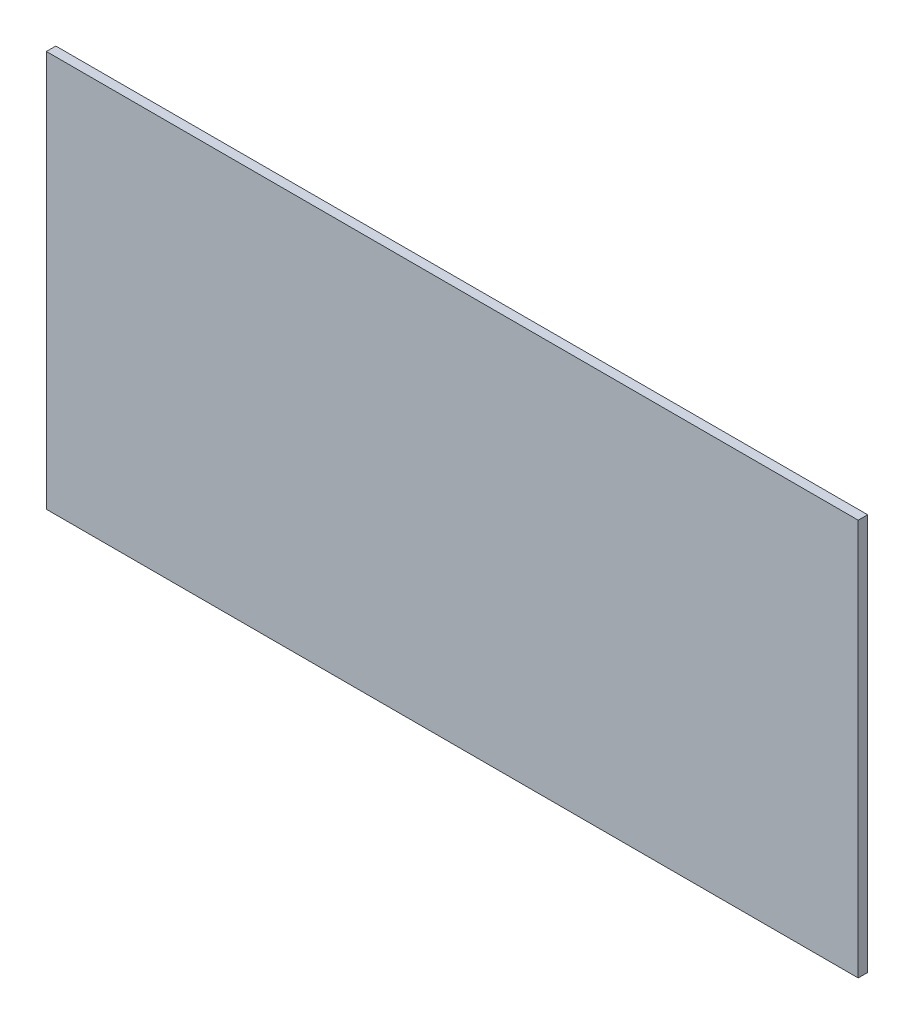
ISO-10303-21;
HEADER;
FILE_DESCRIPTION(('STEP AP214'),'2;1');
FILE_NAME('part.step','',(''),(''),'','','');
FILE_SCHEMA(('AUTOMOTIVE_DESIGN { 1 0 10303 214 1 1 1 1 }'));
ENDSEC;
DATA;
#1=APPLICATION_CONTEXT('core data for automotive mechanical design processes');
#2=APPLICATION_PROTOCOL_DEFINITION('international standard','automotive_design',2000,#1);
#3=PRODUCT_CONTEXT('',#1,'mechanical');
#4=PRODUCT('Part','Part','',(#3));
#5=PRODUCT_RELATED_PRODUCT_CATEGORY('part','',(#4));
#6=PRODUCT_DEFINITION_FORMATION('','',#4);
#7=PRODUCT_DEFINITION_CONTEXT('part definition',#1,'design');
#8=PRODUCT_DEFINITION('design','',#6,#7);
#9=PRODUCT_DEFINITION_SHAPE('','',#8);
#10=(LENGTH_UNIT() NAMED_UNIT(*) SI_UNIT(.MILLI.,.METRE.));
#11=(NAMED_UNIT(*) PLANE_ANGLE_UNIT() SI_UNIT($,.RADIAN.));
#12=(NAMED_UNIT(*) SI_UNIT($,.STERADIAN.) SOLID_ANGLE_UNIT());
#13=UNCERTAINTY_MEASURE_WITH_UNIT(LENGTH_MEASURE(1.E-05),#10,'distance_accuracy_value','');
#14=(GEOMETRIC_REPRESENTATION_CONTEXT(3) GLOBAL_UNCERTAINTY_ASSIGNED_CONTEXT((#13)) GLOBAL_UNIT_ASSIGNED_CONTEXT((#10,
#11,#12)) REPRESENTATION_CONTEXT('',''));
#15=CARTESIAN_POINT('',(0.,0.,0.));
#16=DIRECTION('',(0.,0.,1.));
#17=DIRECTION('',(1.,0.,0.));
#18=AXIS2_PLACEMENT_3D('',#15,#16,#17);
#19=CARTESIAN_POINT('',(0.,0.,1.));
#20=DIRECTION('',(1.,0.,0.));
#21=DIRECTION('',(0.,0.,-1.));
#22=AXIS2_PLACEMENT_3D('',#19,#20,#21);
#23=PLANE('',#22);
#24=DIRECTION('',(0.,-1.,0.));
#25=VECTOR('',#24,1.);
#26=CARTESIAN_POINT('',(0.,0.,0.));
#27=LINE('',#26,#25);
#28=CARTESIAN_POINT('',(0.,42.,0.));
#29=VERTEX_POINT('',#28);
#30=CARTESIAN_POINT('',(0.,0.,0.));
#31=VERTEX_POINT('',#30);
#32=EDGE_CURVE('E105',#29,#31,#27,.T.);
#33=ORIENTED_EDGE('',*,*,#32,.T.);
#34=DIRECTION('',(0.,0.,-1.));
#35=VECTOR('',#34,1.);
#36=CARTESIAN_POINT('',(0.,0.,1.));
#37=LINE('',#36,#35);
#38=CARTESIAN_POINT('',(0.,0.,1.));
#39=VERTEX_POINT('',#38);
#40=EDGE_CURVE('E11',#39,#31,#37,.T.);
#41=ORIENTED_EDGE('',*,*,#40,.F.);
#42=DIRECTION('',(0.,-1.,0.));
#43=VECTOR('',#42,1.);
#44=CARTESIAN_POINT('',(0.,0.,1.));
#45=LINE('',#44,#43);
#46=CARTESIAN_POINT('',(0.,42.,1.));
#47=VERTEX_POINT('',#46);
#48=EDGE_CURVE('E89',#47,#39,#45,.T.);
#49=ORIENTED_EDGE('',*,*,#48,.F.);
#50=DIRECTION('',(0.,0.,-1.));
#51=VECTOR('',#50,1.);
#52=CARTESIAN_POINT('',(0.,42.,1.));
#53=LINE('',#52,#51);
#54=EDGE_CURVE('E97',#47,#29,#53,.T.);
#55=ORIENTED_EDGE('',*,*,#54,.T.);
#56=EDGE_LOOP('',(#33,#41,#49,#55));
#57=FACE_BOUND('',#56,.T.);
#58=ADVANCED_FACE('F39',(#57),#23,.F.);
#59=CARTESIAN_POINT('',(0.,0.,1.));
#60=DIRECTION('',(0.,1.,0.));
#61=DIRECTION('',(0.,0.,1.));
#62=AXIS2_PLACEMENT_3D('',#59,#60,#61);
#63=PLANE('',#62);
#64=DIRECTION('',(1.,0.,0.));
#65=VECTOR('',#64,1.);
#66=CARTESIAN_POINT('',(0.,0.,0.));
#67=LINE('',#66,#65);
#68=CARTESIAN_POINT('',(86.,0.,0.));
#69=VERTEX_POINT('',#68);
#70=EDGE_CURVE('E92',#31,#69,#67,.T.);
#71=ORIENTED_EDGE('',*,*,#70,.T.);
#72=DIRECTION('',(0.,0.,-1.));
#73=VECTOR('',#72,1.);
#74=CARTESIAN_POINT('',(86.,0.,1.));
#75=LINE('',#74,#73);
#76=CARTESIAN_POINT('',(86.,0.,1.));
#77=VERTEX_POINT('',#76);
#78=EDGE_CURVE('E50',#77,#69,#75,.T.);
#79=ORIENTED_EDGE('',*,*,#78,.F.);
#80=DIRECTION('',(1.,0.,0.));
#81=VECTOR('',#80,1.);
#82=CARTESIAN_POINT('',(0.,0.,1.));
#83=LINE('',#82,#81);
#84=EDGE_CURVE('E82',#39,#77,#83,.T.);
#85=ORIENTED_EDGE('',*,*,#84,.F.);
#86=ORIENTED_EDGE('',*,*,#40,.T.);
#87=EDGE_LOOP('',(#71,#79,#85,#86));
#88=FACE_BOUND('',#87,.T.);
#89=ADVANCED_FACE('F93',(#88),#63,.F.);
#90=CARTESIAN_POINT('',(86.,0.,1.));
#91=DIRECTION('',(-1.,0.,0.));
#92=DIRECTION('',(0.,0.,1.));
#93=AXIS2_PLACEMENT_3D('',#90,#91,#92);
#94=PLANE('',#93);
#95=DIRECTION('',(0.,1.,0.));
#96=VECTOR('',#95,1.);
#97=CARTESIAN_POINT('',(86.,0.,0.));
#98=LINE('',#97,#96);
#99=CARTESIAN_POINT('',(86.,42.,0.));
#100=VERTEX_POINT('',#99);
#101=EDGE_CURVE('E72',#69,#100,#98,.T.);
#102=ORIENTED_EDGE('',*,*,#101,.T.);
#103=DIRECTION('',(0.,0.,-1.));
#104=VECTOR('',#103,1.);
#105=CARTESIAN_POINT('',(86.,42.,1.));
#106=LINE('',#105,#104);
#107=CARTESIAN_POINT('',(86.,42.,1.));
#108=VERTEX_POINT('',#107);
#109=EDGE_CURVE('E94',#108,#100,#106,.T.);
#110=ORIENTED_EDGE('',*,*,#109,.F.);
#111=DIRECTION('',(0.,1.,0.));
#112=VECTOR('',#111,1.);
#113=CARTESIAN_POINT('',(86.,0.,1.));
#114=LINE('',#113,#112);
#115=EDGE_CURVE('E88',#77,#108,#114,.T.);
#116=ORIENTED_EDGE('',*,*,#115,.F.);
#117=ORIENTED_EDGE('',*,*,#78,.T.);
#118=EDGE_LOOP('',(#102,#110,#116,#117));
#119=FACE_BOUND('',#118,.T.);
#120=ADVANCED_FACE('F96',(#119),#94,.F.);
#121=CARTESIAN_POINT('',(0.,42.,1.));
#122=DIRECTION('',(0.,-1.,0.));
#123=DIRECTION('',(0.,0.,-1.));
#124=AXIS2_PLACEMENT_3D('',#121,#122,#123);
#125=PLANE('',#124);
#126=DIRECTION('',(-1.,0.,0.));
#127=VECTOR('',#126,1.);
#128=CARTESIAN_POINT('',(0.,42.,0.));
#129=LINE('',#128,#127);
#130=EDGE_CURVE('E76',#100,#29,#129,.T.);
#131=ORIENTED_EDGE('',*,*,#130,.T.);
#132=ORIENTED_EDGE('',*,*,#54,.F.);
#133=DIRECTION('',(-1.,0.,0.));
#134=VECTOR('',#133,1.);
#135=CARTESIAN_POINT('',(0.,42.,1.));
#136=LINE('',#135,#134);
#137=EDGE_CURVE('E54',#108,#47,#136,.T.);
#138=ORIENTED_EDGE('',*,*,#137,.F.);
#139=ORIENTED_EDGE('',*,*,#109,.T.);
#140=EDGE_LOOP('',(#131,#132,#138,#139));
#141=FACE_BOUND('',#140,.T.);
#142=ADVANCED_FACE('F108',(#141),#125,.F.);
#143=CARTESIAN_POINT('',(0.,0.,1.));
#144=DIRECTION('',(0.,0.,-1.));
#145=DIRECTION('',(-1.,0.,0.));
#146=AXIS2_PLACEMENT_3D('',#143,#144,#145);
#147=PLANE('',#146);
#148=ORIENTED_EDGE('',*,*,#48,.T.);
#149=ORIENTED_EDGE('',*,*,#84,.T.);
#150=ORIENTED_EDGE('',*,*,#115,.T.);
#151=ORIENTED_EDGE('',*,*,#137,.T.);
#152=EDGE_LOOP('',(#148,#149,#150,#151));
#153=FACE_BOUND('',#152,.T.);
#154=ADVANCED_FACE('F86',(#153),#147,.F.);
#155=CARTESIAN_POINT('',(0.,0.,0.));
#156=DIRECTION('',(0.,0.,-1.));
#157=DIRECTION('',(-1.,0.,0.));
#158=AXIS2_PLACEMENT_3D('',#155,#156,#157);
#159=PLANE('',#158);
#160=ORIENTED_EDGE('',*,*,#32,.F.);
#161=ORIENTED_EDGE('',*,*,#130,.F.);
#162=ORIENTED_EDGE('',*,*,#101,.F.);
#163=ORIENTED_EDGE('',*,*,#70,.F.);
#164=EDGE_LOOP('',(#160,#161,#162,#163));
#165=FACE_BOUND('',#164,.T.);
#166=ADVANCED_FACE('F115',(#165),#159,.T.);
#167=CLOSED_SHELL('',(#58,#89,#120,#142,#154,#166));
#168=MANIFOLD_SOLID_BREP('B2',#167);
#169=ADVANCED_BREP_SHAPE_REPRESENTATION('',(#18,#168),#14);
#170=SHAPE_DEFINITION_REPRESENTATION(#9,#169);
ENDSEC;
END-ISO-10303-21;
